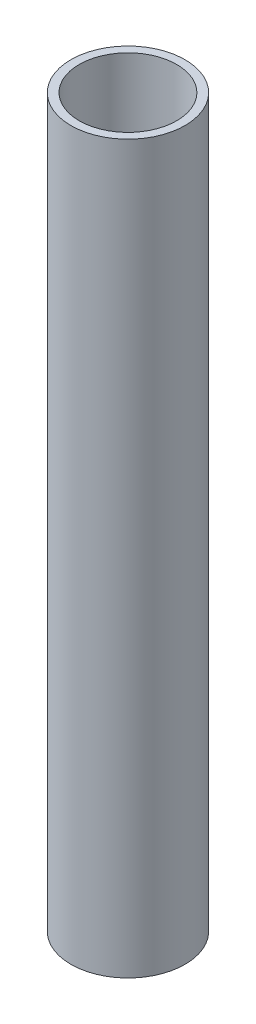
ISO-10303-21;
HEADER;
FILE_DESCRIPTION(('STEP AP214'),'2;1');
FILE_NAME('part.step','',(''),(''),'','','');
FILE_SCHEMA(('AUTOMOTIVE_DESIGN { 1 0 10303 214 1 1 1 1 }'));
ENDSEC;
DATA;
#1=APPLICATION_CONTEXT('core data for automotive mechanical design processes');
#2=APPLICATION_PROTOCOL_DEFINITION('international standard','automotive_design',2000,#1);
#3=PRODUCT_CONTEXT('',#1,'mechanical');
#4=PRODUCT('Part','Part','',(#3));
#5=PRODUCT_RELATED_PRODUCT_CATEGORY('part','',(#4));
#6=PRODUCT_DEFINITION_FORMATION('','',#4);
#7=PRODUCT_DEFINITION_CONTEXT('part definition',#1,'design');
#8=PRODUCT_DEFINITION('design','',#6,#7);
#9=PRODUCT_DEFINITION_SHAPE('','',#8);
#10=(LENGTH_UNIT() NAMED_UNIT(*) SI_UNIT(.MILLI.,.METRE.));
#11=(NAMED_UNIT(*) PLANE_ANGLE_UNIT() SI_UNIT($,.RADIAN.));
#12=(NAMED_UNIT(*) SI_UNIT($,.STERADIAN.) SOLID_ANGLE_UNIT());
#13=UNCERTAINTY_MEASURE_WITH_UNIT(LENGTH_MEASURE(1.E-05),#10,'distance_accuracy_value','');
#14=(GEOMETRIC_REPRESENTATION_CONTEXT(3) GLOBAL_UNCERTAINTY_ASSIGNED_CONTEXT((#13)) GLOBAL_UNIT_ASSIGNED_CONTEXT((#10,
#11,#12)) REPRESENTATION_CONTEXT('',''));
#15=CARTESIAN_POINT('',(0.,0.,0.));
#16=DIRECTION('',(0.,0.,1.));
#17=DIRECTION('',(1.,0.,0.));
#18=AXIS2_PLACEMENT_3D('',#15,#16,#17);
#19=CARTESIAN_POINT('',(0.,175.,0.));
#20=DIRECTION('',(0.,1.,0.));
#21=DIRECTION('',(0.,0.,1.));
#22=AXIS2_PLACEMENT_3D('',#19,#20,#21);
#23=PLANE('',#22);
#24=CARTESIAN_POINT('',(0.,175.,0.));
#25=DIRECTION('',(0.,1.,0.));
#26=DIRECTION('',(0.,0.,1.));
#27=AXIS2_PLACEMENT_3D('',#24,#25,#26);
#28=CIRCLE('',#27,27.5);
#29=CARTESIAN_POINT('',(0.,175.,27.5));
#30=VERTEX_POINT('',#29);
#31=EDGE_CURVE('E10',#30,#30,#28,.T.);
#32=ORIENTED_EDGE('',*,*,#31,.T.);
#33=EDGE_LOOP('',(#32));
#34=FACE_BOUND('',#33,.T.);
#35=CARTESIAN_POINT('',(0.,175.,0.));
#36=DIRECTION('',(0.,1.,0.));
#37=DIRECTION('',(0.,0.,1.));
#38=AXIS2_PLACEMENT_3D('',#35,#36,#37);
#39=CIRCLE('',#38,23.5);
#40=CARTESIAN_POINT('',(0.,175.,23.5));
#41=VERTEX_POINT('',#40);
#42=EDGE_CURVE('E50',#41,#41,#39,.T.);
#43=ORIENTED_EDGE('',*,*,#42,.F.);
#44=EDGE_LOOP('',(#43));
#45=FACE_BOUND('',#44,.T.);
#46=ADVANCED_FACE('F37',(#34,#45),#23,.T.);
#47=CARTESIAN_POINT('',(0.,-175.,0.));
#48=DIRECTION('',(0.,1.,0.));
#49=DIRECTION('',(0.,0.,1.));
#50=AXIS2_PLACEMENT_3D('',#47,#48,#49);
#51=PLANE('',#50);
#52=CARTESIAN_POINT('',(0.,-175.,0.));
#53=DIRECTION('',(0.,1.,0.));
#54=DIRECTION('',(0.,0.,1.));
#55=AXIS2_PLACEMENT_3D('',#52,#53,#54);
#56=CIRCLE('',#55,27.5);
#57=CARTESIAN_POINT('',(0.,-175.,27.5));
#58=VERTEX_POINT('',#57);
#59=EDGE_CURVE('E41',#58,#58,#56,.T.);
#60=ORIENTED_EDGE('',*,*,#59,.F.);
#61=EDGE_LOOP('',(#60));
#62=FACE_BOUND('',#61,.T.);
#63=CARTESIAN_POINT('',(0.,-175.,0.));
#64=DIRECTION('',(0.,1.,0.));
#65=DIRECTION('',(0.,0.,1.));
#66=AXIS2_PLACEMENT_3D('',#63,#64,#65);
#67=CIRCLE('',#66,23.5);
#68=CARTESIAN_POINT('',(0.,-175.,23.5));
#69=VERTEX_POINT('',#68);
#70=EDGE_CURVE('E52',#69,#69,#67,.T.);
#71=ORIENTED_EDGE('',*,*,#70,.T.);
#72=EDGE_LOOP('',(#71));
#73=FACE_BOUND('',#72,.T.);
#74=ADVANCED_FACE('F64',(#62,#73),#51,.F.);
#75=CARTESIAN_POINT('',(0.,175.,0.));
#76=DIRECTION('',(0.,-1.,0.));
#77=DIRECTION('',(0.,0.,-1.));
#78=AXIS2_PLACEMENT_3D('',#75,#76,#77);
#79=CYLINDRICAL_SURFACE('',#78,27.5);
#80=ORIENTED_EDGE('',*,*,#31,.F.);
#81=EDGE_LOOP('',(#80));
#82=FACE_BOUND('',#81,.T.);
#83=ORIENTED_EDGE('',*,*,#59,.T.);
#84=EDGE_LOOP('',(#83));
#85=FACE_BOUND('',#84,.T.);
#86=ADVANCED_FACE('F39',(#82,#85),#79,.T.);
#87=CARTESIAN_POINT('',(0.,175.,0.));
#88=DIRECTION('',(0.,-1.,0.));
#89=DIRECTION('',(0.,0.,-1.));
#90=AXIS2_PLACEMENT_3D('',#87,#88,#89);
#91=CYLINDRICAL_SURFACE('',#90,23.5);
#92=ORIENTED_EDGE('',*,*,#42,.T.);
#93=EDGE_LOOP('',(#92));
#94=FACE_BOUND('',#93,.T.);
#95=ORIENTED_EDGE('',*,*,#70,.F.);
#96=EDGE_LOOP('',(#95));
#97=FACE_BOUND('',#96,.T.);
#98=ADVANCED_FACE('F60',(#94,#97),#91,.F.);
#99=CLOSED_SHELL('',(#46,#74,#86,#98));
#100=MANIFOLD_SOLID_BREP('B2',#99);
#101=ADVANCED_BREP_SHAPE_REPRESENTATION('',(#18,#100),#14);
#102=SHAPE_DEFINITION_REPRESENTATION(#9,#101);
ENDSEC;
END-ISO-10303-21;
